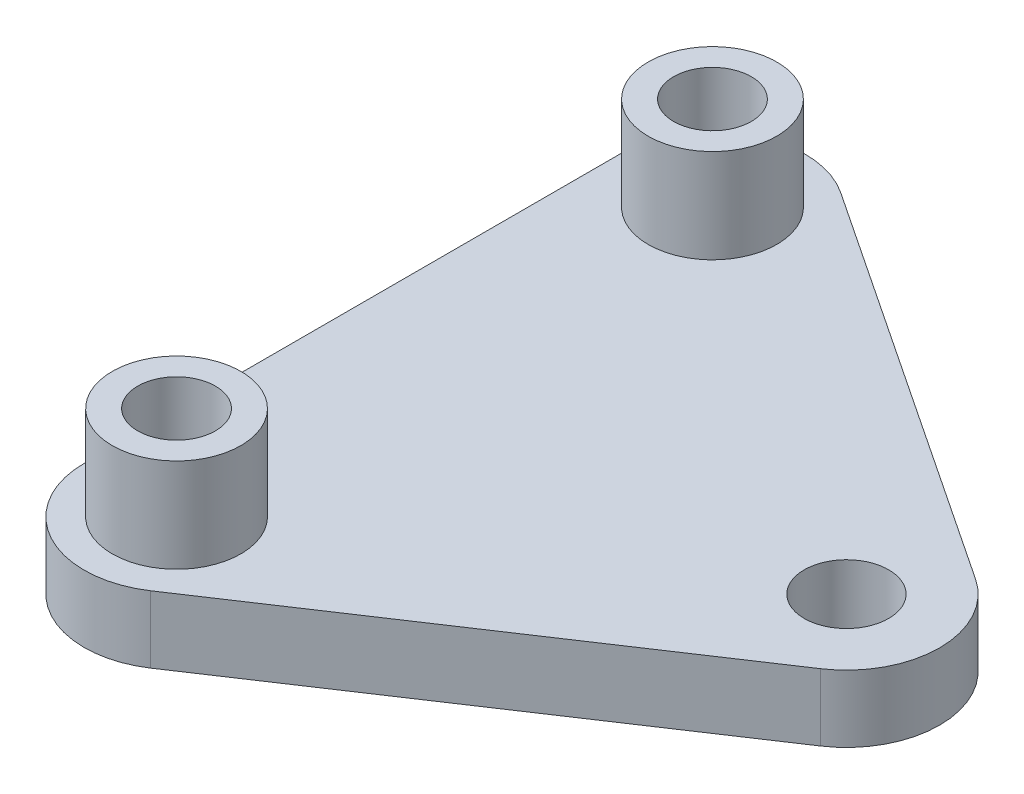
ISO-10303-21;
HEADER;
FILE_DESCRIPTION(('STEP AP214'),'2;1');
FILE_NAME('part.step','',(''),(''),'','','');
FILE_SCHEMA(('AUTOMOTIVE_DESIGN { 1 0 10303 214 1 1 1 1 }'));
ENDSEC;
DATA;
#1=APPLICATION_CONTEXT('core data for automotive mechanical design processes');
#2=APPLICATION_PROTOCOL_DEFINITION('international standard','automotive_design',2000,#1);
#3=PRODUCT_CONTEXT('',#1,'mechanical');
#4=PRODUCT('Part','Part','',(#3));
#5=PRODUCT_RELATED_PRODUCT_CATEGORY('part','',(#4));
#6=PRODUCT_DEFINITION_FORMATION('','',#4);
#7=PRODUCT_DEFINITION_CONTEXT('part definition',#1,'design');
#8=PRODUCT_DEFINITION('design','',#6,#7);
#9=PRODUCT_DEFINITION_SHAPE('','',#8);
#10=(LENGTH_UNIT() NAMED_UNIT(*) SI_UNIT(.MILLI.,.METRE.));
#11=(NAMED_UNIT(*) PLANE_ANGLE_UNIT() SI_UNIT($,.RADIAN.));
#12=(NAMED_UNIT(*) SI_UNIT($,.STERADIAN.) SOLID_ANGLE_UNIT());
#13=UNCERTAINTY_MEASURE_WITH_UNIT(LENGTH_MEASURE(1.E-05),#10,'distance_accuracy_value','');
#14=(GEOMETRIC_REPRESENTATION_CONTEXT(3) GLOBAL_UNCERTAINTY_ASSIGNED_CONTEXT((#13)) GLOBAL_UNIT_ASSIGNED_CONTEXT((#10,
#11,#12)) REPRESENTATION_CONTEXT('',''));
#15=CARTESIAN_POINT('',(0.,0.,0.));
#16=DIRECTION('',(0.,0.,1.));
#17=DIRECTION('',(1.,0.,0.));
#18=AXIS2_PLACEMENT_3D('',#15,#16,#17);
#19=CARTESIAN_POINT('',(0.,2.5,-10.));
#20=DIRECTION('',(0.,1.,0.));
#21=DIRECTION('',(0.,0.,1.));
#22=AXIS2_PLACEMENT_3D('',#19,#20,#21);
#23=PLANE('',#22);
#24=CARTESIAN_POINT('',(15.,2.5,0.));
#25=DIRECTION('',(0.,1.,0.));
#26=DIRECTION('',(0.,0.,1.));
#27=AXIS2_PLACEMENT_3D('',#24,#25,#26);
#28=CIRCLE('',#27,1.575);
#29=CARTESIAN_POINT('',(15.,2.5,1.575));
#30=VERTEX_POINT('',#29);
#31=EDGE_CURVE('E201',#30,#30,#28,.T.);
#32=ORIENTED_EDGE('',*,*,#31,.F.);
#33=EDGE_LOOP('',(#32));
#34=FACE_BOUND('',#33,.T.);
#35=CARTESIAN_POINT('',(0.,2.5,10.));
#36=DIRECTION('',(0.,1.,0.));
#37=DIRECTION('',(0.,0.,1.));
#38=AXIS2_PLACEMENT_3D('',#35,#36,#37);
#39=CIRCLE('',#38,2.4);
#40=CARTESIAN_POINT('',(0.,2.5,12.4));
#41=VERTEX_POINT('',#40);
#42=EDGE_CURVE('E217',#41,#41,#39,.T.);
#43=ORIENTED_EDGE('',*,*,#42,.F.);
#44=EDGE_LOOP('',(#43));
#45=FACE_BOUND('',#44,.T.);
#46=CARTESIAN_POINT('',(0.,2.5,-10.));
#47=DIRECTION('',(0.,1.,0.));
#48=DIRECTION('',(0.,0.,1.));
#49=AXIS2_PLACEMENT_3D('',#46,#47,#48);
#50=CIRCLE('',#49,3.45);
#51=CARTESIAN_POINT('',(1.90973306763416,2.5,-12.8732246014512));
#52=VERTEX_POINT('',#51);
#53=CARTESIAN_POINT('',(-3.45,2.5,-10.));
#54=VERTEX_POINT('',#53);
#55=EDGE_CURVE('E135',#52,#54,#50,.T.);
#56=ORIENTED_EDGE('',*,*,#55,.T.);
#57=DIRECTION('',(0.,0.,1.));
#58=VECTOR('',#57,1.);
#59=CARTESIAN_POINT('',(-3.45,2.5,-10.));
#60=LINE('',#59,#58);
#61=CARTESIAN_POINT('',(-3.45,2.5,10.));
#62=VERTEX_POINT('',#61);
#63=EDGE_CURVE('E93',#54,#62,#60,.T.);
#64=ORIENTED_EDGE('',*,*,#63,.T.);
#65=CARTESIAN_POINT('',(0.,2.5,10.));
#66=DIRECTION('',(0.,1.,0.));
#67=DIRECTION('',(0.,0.,-1.));
#68=AXIS2_PLACEMENT_3D('',#65,#66,#67);
#69=CIRCLE('',#68,3.45);
#70=CARTESIAN_POINT('',(1.90973306763416,2.5,12.8732246014512));
#71=VERTEX_POINT('',#70);
#72=EDGE_CURVE('E106',#62,#71,#69,.T.);
#73=ORIENTED_EDGE('',*,*,#72,.T.);
#74=DIRECTION('',(0.83281872505833,0.,-0.553545816705553));
#75=VECTOR('',#74,1.);
#76=CARTESIAN_POINT('',(1.90973306763416,2.5,12.8732246014512));
#77=LINE('',#76,#75);
#78=CARTESIAN_POINT('',(16.9235717130518,2.5,2.8940450695777));
#79=VERTEX_POINT('',#78);
#80=EDGE_CURVE('E100',#71,#79,#77,.T.);
#81=ORIENTED_EDGE('',*,*,#80,.T.);
#82=CARTESIAN_POINT('',(15.,2.5,0.));
#83=DIRECTION('',(0.,1.,0.));
#84=DIRECTION('',(0.,0.,1.));
#85=AXIS2_PLACEMENT_3D('',#82,#83,#84);
#86=CIRCLE('',#85,3.475);
#87=CARTESIAN_POINT('',(16.9235717130518,2.5,-2.8940450695777));
#88=VERTEX_POINT('',#87);
#89=EDGE_CURVE('E104',#79,#88,#86,.T.);
#90=ORIENTED_EDGE('',*,*,#89,.T.);
#91=DIRECTION('',(-0.83281872505833,0.,-0.553545816705553));
#92=VECTOR('',#91,1.);
#93=CARTESIAN_POINT('',(1.90973306763416,2.5,-12.8732246014512));
#94=LINE('',#93,#92);
#95=EDGE_CURVE('E56',#88,#52,#94,.T.);
#96=ORIENTED_EDGE('',*,*,#95,.T.);
#97=EDGE_LOOP('',(#56,#64,#73,#81,#90,#96));
#98=FACE_BOUND('',#97,.T.);
#99=CARTESIAN_POINT('',(0.,2.5,-10.));
#100=DIRECTION('',(0.,1.,0.));
#101=DIRECTION('',(0.,0.,1.));
#102=AXIS2_PLACEMENT_3D('',#99,#100,#101);
#103=CIRCLE('',#102,2.4);
#104=CARTESIAN_POINT('',(0.,2.5,-7.6));
#105=VERTEX_POINT('',#104);
#106=EDGE_CURVE('E209',#105,#105,#103,.T.);
#107=ORIENTED_EDGE('',*,*,#106,.F.);
#108=EDGE_LOOP('',(#107));
#109=FACE_BOUND('',#108,.T.);
#110=ADVANCED_FACE('F39',(#34,#45,#98,#109),#23,.T.);
#111=CARTESIAN_POINT('',(0.,0.,-10.));
#112=DIRECTION('',(0.,1.,0.));
#113=DIRECTION('',(0.,0.,1.));
#114=AXIS2_PLACEMENT_3D('',#111,#112,#113);
#115=PLANE('',#114);
#116=CARTESIAN_POINT('',(15.,0.,0.));
#117=DIRECTION('',(0.,1.,0.));
#118=DIRECTION('',(0.,0.,1.));
#119=AXIS2_PLACEMENT_3D('',#116,#117,#118);
#120=CIRCLE('',#119,1.575);
#121=CARTESIAN_POINT('',(15.,0.,1.575));
#122=VERTEX_POINT('',#121);
#123=EDGE_CURVE('E199',#122,#122,#120,.T.);
#124=ORIENTED_EDGE('',*,*,#123,.T.);
#125=EDGE_LOOP('',(#124));
#126=FACE_BOUND('',#125,.T.);
#127=CARTESIAN_POINT('',(0.,0.,-10.));
#128=DIRECTION('',(0.,1.,0.));
#129=DIRECTION('',(0.,0.,1.));
#130=AXIS2_PLACEMENT_3D('',#127,#128,#129);
#131=CIRCLE('',#130,3.45);
#132=CARTESIAN_POINT('',(1.90973306763416,0.,-12.8732246014512));
#133=VERTEX_POINT('',#132);
#134=CARTESIAN_POINT('',(-3.45,0.,-10.));
#135=VERTEX_POINT('',#134);
#136=EDGE_CURVE('E124',#133,#135,#131,.T.);
#137=ORIENTED_EDGE('',*,*,#136,.F.);
#138=DIRECTION('',(-0.83281872505833,0.,-0.553545816705553));
#139=VECTOR('',#138,1.);
#140=CARTESIAN_POINT('',(1.90973306763416,0.,-12.8732246014512));
#141=LINE('',#140,#139);
#142=CARTESIAN_POINT('',(16.9235717130518,0.,-2.8940450695777));
#143=VERTEX_POINT('',#142);
#144=EDGE_CURVE('E85',#143,#133,#141,.T.);
#145=ORIENTED_EDGE('',*,*,#144,.F.);
#146=CARTESIAN_POINT('',(15.,0.,0.));
#147=DIRECTION('',(0.,1.,0.));
#148=DIRECTION('',(0.,0.,1.));
#149=AXIS2_PLACEMENT_3D('',#146,#147,#148);
#150=CIRCLE('',#149,3.475);
#151=CARTESIAN_POINT('',(16.9235717130518,0.,2.8940450695777));
#152=VERTEX_POINT('',#151);
#153=EDGE_CURVE('E79',#152,#143,#150,.T.);
#154=ORIENTED_EDGE('',*,*,#153,.F.);
#155=DIRECTION('',(0.83281872505833,0.,-0.553545816705553));
#156=VECTOR('',#155,1.);
#157=CARTESIAN_POINT('',(1.90973306763416,0.,12.8732246014512));
#158=LINE('',#157,#156);
#159=CARTESIAN_POINT('',(1.90973306763416,0.,12.8732246014512));
#160=VERTEX_POINT('',#159);
#161=EDGE_CURVE('E114',#160,#152,#158,.T.);
#162=ORIENTED_EDGE('',*,*,#161,.F.);
#163=CARTESIAN_POINT('',(0.,0.,10.));
#164=DIRECTION('',(0.,1.,0.));
#165=DIRECTION('',(0.,0.,-1.));
#166=AXIS2_PLACEMENT_3D('',#163,#164,#165);
#167=CIRCLE('',#166,3.45);
#168=CARTESIAN_POINT('',(-3.45,0.,10.));
#169=VERTEX_POINT('',#168);
#170=EDGE_CURVE('E130',#169,#160,#167,.T.);
#171=ORIENTED_EDGE('',*,*,#170,.F.);
#172=DIRECTION('',(0.,0.,1.));
#173=VECTOR('',#172,1.);
#174=CARTESIAN_POINT('',(-3.45,0.,-10.));
#175=LINE('',#174,#173);
#176=EDGE_CURVE('E127',#135,#169,#175,.T.);
#177=ORIENTED_EDGE('',*,*,#176,.F.);
#178=EDGE_LOOP('',(#137,#145,#154,#162,#171,#177));
#179=FACE_BOUND('',#178,.T.);
#180=CARTESIAN_POINT('',(0.,0.,-10.));
#181=DIRECTION('',(0.,1.,0.));
#182=DIRECTION('',(0.,0.,1.));
#183=AXIS2_PLACEMENT_3D('',#180,#181,#182);
#184=CIRCLE('',#183,1.45);
#185=CARTESIAN_POINT('',(0.,0.,-8.55));
#186=VERTEX_POINT('',#185);
#187=EDGE_CURVE('E128',#186,#186,#184,.T.);
#188=ORIENTED_EDGE('',*,*,#187,.T.);
#189=EDGE_LOOP('',(#188));
#190=FACE_BOUND('',#189,.T.);
#191=CARTESIAN_POINT('',(0.,0.,10.));
#192=DIRECTION('',(0.,1.,0.));
#193=DIRECTION('',(0.,0.,-1.));
#194=AXIS2_PLACEMENT_3D('',#191,#192,#193);
#195=CIRCLE('',#194,1.45);
#196=CARTESIAN_POINT('',(0.,0.,8.55));
#197=VERTEX_POINT('',#196);
#198=EDGE_CURVE('E214',#197,#197,#195,.T.);
#199=ORIENTED_EDGE('',*,*,#198,.T.);
#200=EDGE_LOOP('',(#199));
#201=FACE_BOUND('',#200,.T.);
#202=ADVANCED_FACE('F144',(#126,#179,#190,#201),#115,.F.);
#203=CARTESIAN_POINT('',(0.,2.5,-10.));
#204=DIRECTION('',(0.,-1.,0.));
#205=DIRECTION('',(0.,0.,-1.));
#206=AXIS2_PLACEMENT_3D('',#203,#204,#205);
#207=CYLINDRICAL_SURFACE('',#206,3.45);
#208=ORIENTED_EDGE('',*,*,#136,.T.);
#209=DIRECTION('',(0.,-1.,0.));
#210=VECTOR('',#209,1.);
#211=CARTESIAN_POINT('',(-3.45,2.5,-10.));
#212=LINE('',#211,#210);
#213=EDGE_CURVE('E11',#54,#135,#212,.T.);
#214=ORIENTED_EDGE('',*,*,#213,.F.);
#215=ORIENTED_EDGE('',*,*,#55,.F.);
#216=DIRECTION('',(0.,-1.,0.));
#217=VECTOR('',#216,1.);
#218=CARTESIAN_POINT('',(1.90973306763416,2.5,-12.8732246014512));
#219=LINE('',#218,#217);
#220=EDGE_CURVE('E120',#52,#133,#219,.T.);
#221=ORIENTED_EDGE('',*,*,#220,.T.);
#222=EDGE_LOOP('',(#208,#214,#215,#221));
#223=FACE_BOUND('',#222,.T.);
#224=ADVANCED_FACE('F41',(#223),#207,.T.);
#225=CARTESIAN_POINT('',(-3.45,2.5,-10.));
#226=DIRECTION('',(1.,0.,0.));
#227=DIRECTION('',(0.,0.,-1.));
#228=AXIS2_PLACEMENT_3D('',#225,#226,#227);
#229=PLANE('',#228);
#230=ORIENTED_EDGE('',*,*,#176,.T.);
#231=DIRECTION('',(0.,-1.,0.));
#232=VECTOR('',#231,1.);
#233=CARTESIAN_POINT('',(-3.45,2.5,10.));
#234=LINE('',#233,#232);
#235=EDGE_CURVE('E48',#62,#169,#234,.T.);
#236=ORIENTED_EDGE('',*,*,#235,.F.);
#237=ORIENTED_EDGE('',*,*,#63,.F.);
#238=ORIENTED_EDGE('',*,*,#213,.T.);
#239=EDGE_LOOP('',(#230,#236,#237,#238));
#240=FACE_BOUND('',#239,.T.);
#241=ADVANCED_FACE('F260',(#240),#229,.F.);
#242=CARTESIAN_POINT('',(0.,2.5,10.));
#243=DIRECTION('',(0.,-1.,0.));
#244=DIRECTION('',(0.,0.,-1.));
#245=AXIS2_PLACEMENT_3D('',#242,#243,#244);
#246=CYLINDRICAL_SURFACE('',#245,3.45);
#247=ORIENTED_EDGE('',*,*,#170,.T.);
#248=DIRECTION('',(0.,-1.,0.));
#249=VECTOR('',#248,1.);
#250=CARTESIAN_POINT('',(1.90973306763416,2.5,12.8732246014512));
#251=LINE('',#250,#249);
#252=EDGE_CURVE('E115',#71,#160,#251,.T.);
#253=ORIENTED_EDGE('',*,*,#252,.F.);
#254=ORIENTED_EDGE('',*,*,#72,.F.);
#255=ORIENTED_EDGE('',*,*,#235,.T.);
#256=EDGE_LOOP('',(#247,#253,#254,#255));
#257=FACE_BOUND('',#256,.T.);
#258=ADVANCED_FACE('F141',(#257),#246,.T.);
#259=CARTESIAN_POINT('',(1.90973306763416,2.5,12.8732246014512));
#260=DIRECTION('',(-0.553545816705553,0.,-0.83281872505833));
#261=DIRECTION('',(-0.83281872505833,0.,0.553545816705553));
#262=AXIS2_PLACEMENT_3D('',#259,#260,#261);
#263=PLANE('',#262);
#264=ORIENTED_EDGE('',*,*,#161,.T.);
#265=DIRECTION('',(0.,-1.,0.));
#266=VECTOR('',#265,1.);
#267=CARTESIAN_POINT('',(16.9235717130518,2.5,2.8940450695777));
#268=LINE('',#267,#266);
#269=EDGE_CURVE('E111',#79,#152,#268,.T.);
#270=ORIENTED_EDGE('',*,*,#269,.F.);
#271=ORIENTED_EDGE('',*,*,#80,.F.);
#272=ORIENTED_EDGE('',*,*,#252,.T.);
#273=EDGE_LOOP('',(#264,#270,#271,#272));
#274=FACE_BOUND('',#273,.T.);
#275=ADVANCED_FACE('F112',(#274),#263,.F.);
#276=CARTESIAN_POINT('',(15.,2.5,0.));
#277=DIRECTION('',(0.,-1.,0.));
#278=DIRECTION('',(0.,0.,-1.));
#279=AXIS2_PLACEMENT_3D('',#276,#277,#278);
#280=CYLINDRICAL_SURFACE('',#279,3.475);
#281=ORIENTED_EDGE('',*,*,#153,.T.);
#282=DIRECTION('',(0.,-1.,0.));
#283=VECTOR('',#282,1.);
#284=CARTESIAN_POINT('',(16.9235717130518,2.5,-2.8940450695777));
#285=LINE('',#284,#283);
#286=EDGE_CURVE('E116',#88,#143,#285,.T.);
#287=ORIENTED_EDGE('',*,*,#286,.F.);
#288=ORIENTED_EDGE('',*,*,#89,.F.);
#289=ORIENTED_EDGE('',*,*,#269,.T.);
#290=EDGE_LOOP('',(#281,#287,#288,#289));
#291=FACE_BOUND('',#290,.T.);
#292=ADVANCED_FACE('F118',(#291),#280,.T.);
#293=CARTESIAN_POINT('',(1.90973306763416,2.5,-12.8732246014512));
#294=DIRECTION('',(-0.553545816705553,0.,0.83281872505833));
#295=DIRECTION('',(0.83281872505833,0.,0.553545816705553));
#296=AXIS2_PLACEMENT_3D('',#293,#294,#295);
#297=PLANE('',#296);
#298=ORIENTED_EDGE('',*,*,#144,.T.);
#299=ORIENTED_EDGE('',*,*,#220,.F.);
#300=ORIENTED_EDGE('',*,*,#95,.F.);
#301=ORIENTED_EDGE('',*,*,#286,.T.);
#302=EDGE_LOOP('',(#298,#299,#300,#301));
#303=FACE_BOUND('',#302,.T.);
#304=ADVANCED_FACE('F149',(#303),#297,.F.);
#305=CARTESIAN_POINT('',(0.,2.5,-10.));
#306=DIRECTION('',(0.,-1.,0.));
#307=DIRECTION('',(0.,0.,-1.));
#308=AXIS2_PLACEMENT_3D('',#305,#306,#307);
#309=CYLINDRICAL_SURFACE('',#308,1.45);
#310=ORIENTED_EDGE('',*,*,#187,.F.);
#311=EDGE_LOOP('',(#310));
#312=FACE_BOUND('',#311,.T.);
#313=CARTESIAN_POINT('',(0.,6.,-10.));
#314=DIRECTION('',(0.,1.,0.));
#315=DIRECTION('',(0.,0.,1.));
#316=AXIS2_PLACEMENT_3D('',#313,#314,#315);
#317=CIRCLE('',#316,1.45);
#318=CARTESIAN_POINT('',(0.,6.,-8.55));
#319=VERTEX_POINT('',#318);
#320=EDGE_CURVE('E206',#319,#319,#317,.T.);
#321=ORIENTED_EDGE('',*,*,#320,.T.);
#322=EDGE_LOOP('',(#321));
#323=FACE_BOUND('',#322,.T.);
#324=ADVANCED_FACE('F151',(#312,#323),#309,.F.);
#325=CARTESIAN_POINT('',(0.,2.5,10.));
#326=DIRECTION('',(0.,-1.,0.));
#327=DIRECTION('',(0.,0.,-1.));
#328=AXIS2_PLACEMENT_3D('',#325,#326,#327);
#329=CYLINDRICAL_SURFACE('',#328,1.45);
#330=ORIENTED_EDGE('',*,*,#198,.F.);
#331=EDGE_LOOP('',(#330));
#332=FACE_BOUND('',#331,.T.);
#333=CARTESIAN_POINT('',(0.,6.,10.));
#334=DIRECTION('',(0.,1.,0.));
#335=DIRECTION('',(0.,0.,1.));
#336=AXIS2_PLACEMENT_3D('',#333,#334,#335);
#337=CIRCLE('',#336,1.45);
#338=CARTESIAN_POINT('',(0.,6.,11.45));
#339=VERTEX_POINT('',#338);
#340=EDGE_CURVE('E210',#339,#339,#337,.T.);
#341=ORIENTED_EDGE('',*,*,#340,.T.);
#342=EDGE_LOOP('',(#341));
#343=FACE_BOUND('',#342,.T.);
#344=ADVANCED_FACE('F157',(#332,#343),#329,.F.);
#345=CARTESIAN_POINT('',(0.,6.,10.));
#346=DIRECTION('',(0.,1.,0.));
#347=DIRECTION('',(0.,0.,1.));
#348=AXIS2_PLACEMENT_3D('',#345,#346,#347);
#349=PLANE('',#348);
#350=CARTESIAN_POINT('',(0.,6.,10.));
#351=DIRECTION('',(0.,1.,0.));
#352=DIRECTION('',(0.,0.,1.));
#353=AXIS2_PLACEMENT_3D('',#350,#351,#352);
#354=CIRCLE('',#353,2.4);
#355=CARTESIAN_POINT('',(0.,6.,12.4));
#356=VERTEX_POINT('',#355);
#357=EDGE_CURVE('E203',#356,#356,#354,.T.);
#358=ORIENTED_EDGE('',*,*,#357,.T.);
#359=EDGE_LOOP('',(#358));
#360=FACE_BOUND('',#359,.T.);
#361=ORIENTED_EDGE('',*,*,#340,.F.);
#362=EDGE_LOOP('',(#361));
#363=FACE_BOUND('',#362,.T.);
#364=ADVANCED_FACE('F175',(#360,#363),#349,.T.);
#365=CARTESIAN_POINT('',(0.,6.,10.));
#366=DIRECTION('',(0.,-1.,0.));
#367=DIRECTION('',(0.,0.,-1.));
#368=AXIS2_PLACEMENT_3D('',#365,#366,#367);
#369=CYLINDRICAL_SURFACE('',#368,2.4);
#370=ORIENTED_EDGE('',*,*,#357,.F.);
#371=EDGE_LOOP('',(#370));
#372=FACE_BOUND('',#371,.T.);
#373=ORIENTED_EDGE('',*,*,#42,.T.);
#374=EDGE_LOOP('',(#373));
#375=FACE_BOUND('',#374,.T.);
#376=ADVANCED_FACE('F179',(#372,#375),#369,.T.);
#377=CARTESIAN_POINT('',(0.,6.,-10.));
#378=DIRECTION('',(0.,1.,0.));
#379=DIRECTION('',(0.,0.,1.));
#380=AXIS2_PLACEMENT_3D('',#377,#378,#379);
#381=PLANE('',#380);
#382=CARTESIAN_POINT('',(0.,6.,-10.));
#383=DIRECTION('',(0.,1.,0.));
#384=DIRECTION('',(0.,0.,1.));
#385=AXIS2_PLACEMENT_3D('',#382,#383,#384);
#386=CIRCLE('',#385,2.4);
#387=CARTESIAN_POINT('',(0.,6.,-7.6));
#388=VERTEX_POINT('',#387);
#389=EDGE_CURVE('E211',#388,#388,#386,.T.);
#390=ORIENTED_EDGE('',*,*,#389,.T.);
#391=EDGE_LOOP('',(#390));
#392=FACE_BOUND('',#391,.T.);
#393=ORIENTED_EDGE('',*,*,#320,.F.);
#394=EDGE_LOOP('',(#393));
#395=FACE_BOUND('',#394,.T.);
#396=ADVANCED_FACE('F183',(#392,#395),#381,.T.);
#397=CARTESIAN_POINT('',(0.,6.,-10.));
#398=DIRECTION('',(0.,-1.,0.));
#399=DIRECTION('',(0.,0.,-1.));
#400=AXIS2_PLACEMENT_3D('',#397,#398,#399);
#401=CYLINDRICAL_SURFACE('',#400,2.4);
#402=ORIENTED_EDGE('',*,*,#389,.F.);
#403=EDGE_LOOP('',(#402));
#404=FACE_BOUND('',#403,.T.);
#405=ORIENTED_EDGE('',*,*,#106,.T.);
#406=EDGE_LOOP('',(#405));
#407=FACE_BOUND('',#406,.T.);
#408=ADVANCED_FACE('F185',(#404,#407),#401,.T.);
#409=CARTESIAN_POINT('',(15.,0.,0.));
#410=DIRECTION('',(0.,1.,0.));
#411=DIRECTION('',(0.,0.,1.));
#412=AXIS2_PLACEMENT_3D('',#409,#410,#411);
#413=CYLINDRICAL_SURFACE('',#412,1.575);
#414=ORIENTED_EDGE('',*,*,#123,.F.);
#415=EDGE_LOOP('',(#414));
#416=FACE_BOUND('',#415,.T.);
#417=ORIENTED_EDGE('',*,*,#31,.T.);
#418=EDGE_LOOP('',(#417));
#419=FACE_BOUND('',#418,.T.);
#420=ADVANCED_FACE('F187',(#416,#419),#413,.F.);
#421=CLOSED_SHELL('',(#110,#202,#224,#241,#258,#275,#292,#304,#324,#344,#364,#376,#396,#408,#420));
#422=MANIFOLD_SOLID_BREP('B2',#421);
#423=ADVANCED_BREP_SHAPE_REPRESENTATION('',(#18,#422),#14);
#424=SHAPE_DEFINITION_REPRESENTATION(#9,#423);
ENDSEC;
END-ISO-10303-21;
